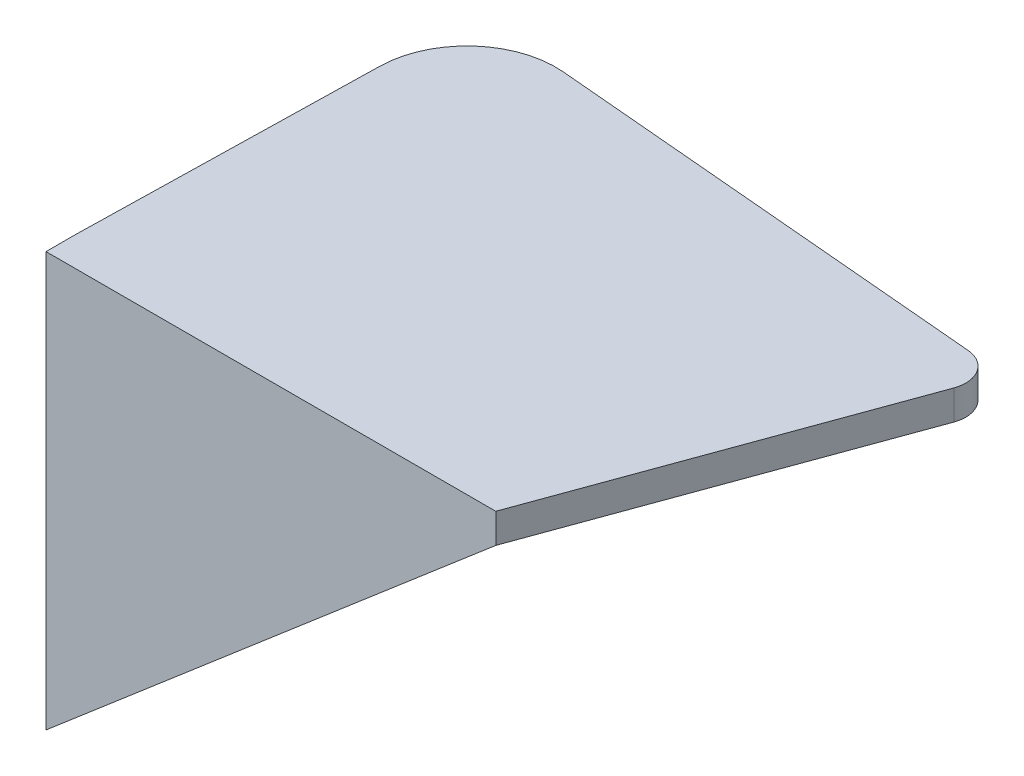
ISO-10303-21;
HEADER;
FILE_DESCRIPTION(('STEP AP214'),'2;1');
FILE_NAME('part.step','',(''),(''),'','','');
FILE_SCHEMA(('AUTOMOTIVE_DESIGN { 1 0 10303 214 1 1 1 1 }'));
ENDSEC;
DATA;
#1=APPLICATION_CONTEXT('core data for automotive mechanical design processes');
#2=APPLICATION_PROTOCOL_DEFINITION('international standard','automotive_design',2000,#1);
#3=PRODUCT_CONTEXT('',#1,'mechanical');
#4=PRODUCT('Part','Part','',(#3));
#5=PRODUCT_RELATED_PRODUCT_CATEGORY('part','',(#4));
#6=PRODUCT_DEFINITION_FORMATION('','',#4);
#7=PRODUCT_DEFINITION_CONTEXT('part definition',#1,'design');
#8=PRODUCT_DEFINITION('design','',#6,#7);
#9=PRODUCT_DEFINITION_SHAPE('','',#8);
#10=(LENGTH_UNIT() NAMED_UNIT(*) SI_UNIT(.MILLI.,.METRE.));
#11=(NAMED_UNIT(*) PLANE_ANGLE_UNIT() SI_UNIT($,.RADIAN.));
#12=(NAMED_UNIT(*) SI_UNIT($,.STERADIAN.) SOLID_ANGLE_UNIT());
#13=UNCERTAINTY_MEASURE_WITH_UNIT(LENGTH_MEASURE(1.E-05),#10,'distance_accuracy_value','');
#14=(GEOMETRIC_REPRESENTATION_CONTEXT(3) GLOBAL_UNCERTAINTY_ASSIGNED_CONTEXT((#13)) GLOBAL_UNIT_ASSIGNED_CONTEXT((#10,
#11,#12)) REPRESENTATION_CONTEXT('',''));
#15=CARTESIAN_POINT('',(0.,0.,0.));
#16=DIRECTION('',(0.,0.,1.));
#17=DIRECTION('',(1.,0.,0.));
#18=AXIS2_PLACEMENT_3D('',#15,#16,#17);
#19=CARTESIAN_POINT('',(0.,-130.,-10.));
#20=DIRECTION('',(-1.,0.,0.));
#21=DIRECTION('',(0.,0.,1.));
#22=AXIS2_PLACEMENT_3D('',#19,#20,#21);
#23=PLANE('',#22);
#24=DIRECTION('',(0.,-1.,0.));
#25=VECTOR('',#24,1.);
#26=CARTESIAN_POINT('',(0.,-130.,0.));
#27=LINE('',#26,#25);
#28=CARTESIAN_POINT('',(0.,10.,0.));
#29=VERTEX_POINT('',#28);
#30=CARTESIAN_POINT('',(0.,-130.,0.));
#31=VERTEX_POINT('',#30);
#32=EDGE_CURVE('E154',#29,#31,#27,.T.);
#33=ORIENTED_EDGE('',*,*,#32,.F.);
#34=DIRECTION('',(0.,0.,1.));
#35=VECTOR('',#34,1.);
#36=CARTESIAN_POINT('',(0.,10.,0.));
#37=LINE('',#36,#35);
#38=CARTESIAN_POINT('',(0.,10.,-10.));
#39=VERTEX_POINT('',#38);
#40=EDGE_CURVE('E177',#39,#29,#37,.T.);
#41=ORIENTED_EDGE('',*,*,#40,.F.);
#42=DIRECTION('',(0.,-1.,0.));
#43=VECTOR('',#42,1.);
#44=CARTESIAN_POINT('',(0.,10.,-10.));
#45=LINE('',#44,#43);
#46=CARTESIAN_POINT('',(0.,0.,-10.));
#47=VERTEX_POINT('',#46);
#48=EDGE_CURVE('E149',#39,#47,#45,.T.);
#49=ORIENTED_EDGE('',*,*,#48,.T.);
#50=DIRECTION('',(0.,-1.,0.));
#51=VECTOR('',#50,1.);
#52=CARTESIAN_POINT('',(0.,-130.,-10.));
#53=LINE('',#52,#51);
#54=CARTESIAN_POINT('',(0.,-130.,-10.));
#55=VERTEX_POINT('',#54);
#56=EDGE_CURVE('E155',#47,#55,#53,.T.);
#57=ORIENTED_EDGE('',*,*,#56,.T.);
#58=DIRECTION('',(0.,0.,1.));
#59=VECTOR('',#58,1.);
#60=CARTESIAN_POINT('',(0.,-130.,-10.));
#61=LINE('',#60,#59);
#62=EDGE_CURVE('E35',#55,#31,#61,.T.);
#63=ORIENTED_EDGE('',*,*,#62,.T.);
#64=EDGE_LOOP('',(#33,#41,#49,#57,#63));
#65=FACE_BOUND('',#64,.T.);
#66=ADVANCED_FACE('F32',(#65),#23,.T.);
#67=CARTESIAN_POINT('',(151.986841535707,0.,-10.));
#68=DIRECTION('',(0.65,-0.759934207678533,0.));
#69=DIRECTION('',(0.759934207678533,0.65,0.));
#70=AXIS2_PLACEMENT_3D('',#67,#68,#69);
#71=PLANE('',#70);
#72=DIRECTION('',(0.759934207678533,0.65,0.));
#73=VECTOR('',#72,1.);
#74=CARTESIAN_POINT('',(151.986841535707,0.,0.));
#75=LINE('',#74,#73);
#76=CARTESIAN_POINT('',(151.986841535707,0.,0.));
#77=VERTEX_POINT('',#76);
#78=EDGE_CURVE('E157',#31,#77,#75,.T.);
#79=ORIENTED_EDGE('',*,*,#78,.F.);
#80=ORIENTED_EDGE('',*,*,#62,.F.);
#81=DIRECTION('',(0.759934207678533,0.65,0.));
#82=VECTOR('',#81,1.);
#83=CARTESIAN_POINT('',(151.986841535707,0.,-10.));
#84=LINE('',#83,#82);
#85=CARTESIAN_POINT('',(151.986841535707,0.,-10.));
#86=VERTEX_POINT('',#85);
#87=EDGE_CURVE('E47',#55,#86,#84,.T.);
#88=ORIENTED_EDGE('',*,*,#87,.T.);
#89=DIRECTION('',(0.,0.,1.));
#90=VECTOR('',#89,1.);
#91=CARTESIAN_POINT('',(151.986841535707,0.,-10.));
#92=LINE('',#91,#90);
#93=EDGE_CURVE('E11',#86,#77,#92,.T.);
#94=ORIENTED_EDGE('',*,*,#93,.T.);
#95=EDGE_LOOP('',(#79,#80,#88,#94));
#96=FACE_BOUND('',#95,.T.);
#97=ADVANCED_FACE('F185',(#96),#71,.T.);
#98=CARTESIAN_POINT('',(0.,0.,-10.));
#99=DIRECTION('',(0.,0.,-1.));
#100=DIRECTION('',(-1.,0.,0.));
#101=AXIS2_PLACEMENT_3D('',#98,#99,#100);
#102=PLANE('',#101);
#103=ORIENTED_EDGE('',*,*,#56,.F.);
#104=DIRECTION('',(-1.,0.,0.));
#105=VECTOR('',#104,1.);
#106=CARTESIAN_POINT('',(0.,0.,-10.));
#107=LINE('',#106,#105);
#108=EDGE_CURVE('E159',#86,#47,#107,.T.);
#109=ORIENTED_EDGE('',*,*,#108,.F.);
#110=ORIENTED_EDGE('',*,*,#87,.F.);
#111=EDGE_LOOP('',(#103,#109,#110));
#112=FACE_BOUND('',#111,.T.);
#113=ADVANCED_FACE('F183',(#112),#102,.T.);
#114=CARTESIAN_POINT('',(0.,0.,0.));
#115=DIRECTION('',(0.,0.,-1.));
#116=DIRECTION('',(-1.,0.,0.));
#117=AXIS2_PLACEMENT_3D('',#114,#115,#116);
#118=PLANE('',#117);
#119=ORIENTED_EDGE('',*,*,#32,.T.);
#120=ORIENTED_EDGE('',*,*,#78,.T.);
#121=DIRECTION('',(0.,-1.,0.));
#122=VECTOR('',#121,1.);
#123=CARTESIAN_POINT('',(151.986841535707,10.,0.));
#124=LINE('',#123,#122);
#125=CARTESIAN_POINT('',(151.986841535707,10.,0.));
#126=VERTEX_POINT('',#125);
#127=EDGE_CURVE('E126',#126,#77,#124,.T.);
#128=ORIENTED_EDGE('',*,*,#127,.F.);
#129=DIRECTION('',(1.,0.,0.));
#130=VECTOR('',#129,1.);
#131=CARTESIAN_POINT('',(0.,10.,0.));
#132=LINE('',#131,#130);
#133=EDGE_CURVE('E114',#29,#126,#132,.T.);
#134=ORIENTED_EDGE('',*,*,#133,.F.);
#135=EDGE_LOOP('',(#119,#120,#128,#134));
#136=FACE_BOUND('',#135,.T.);
#137=ADVANCED_FACE('F166',(#136),#118,.F.);
#138=CARTESIAN_POINT('',(32.1554391729952,10.,-110.114159057248));
#139=DIRECTION('',(0.,-1.,0.));
#140=DIRECTION('',(0.,0.,-1.));
#141=AXIS2_PLACEMENT_3D('',#138,#139,#140);
#142=CYLINDRICAL_SURFACE('',#141,30.);
#143=CARTESIAN_POINT('',(32.1554391729952,0.,-110.114159057248));
#144=DIRECTION('',(0.,1.,0.));
#145=DIRECTION('',(0.,0.,1.));
#146=AXIS2_PLACEMENT_3D('',#143,#144,#145);
#147=CIRCLE('',#146,30.);
#148=CARTESIAN_POINT('',(34.7701114554249,0.,-140.));
#149=VERTEX_POINT('',#148);
#150=CARTESIAN_POINT('',(2.16234528639779,0.,-110.757835303318));
#151=VERTEX_POINT('',#150);
#152=EDGE_CURVE('E135',#149,#151,#147,.T.);
#153=ORIENTED_EDGE('',*,*,#152,.T.);
#154=DIRECTION('',(0.,-1.,0.));
#155=VECTOR('',#154,1.);
#156=CARTESIAN_POINT('',(2.16234528639779,10.,-110.757835303318));
#157=LINE('',#156,#155);
#158=CARTESIAN_POINT('',(2.16234528639779,10.,-110.757835303318));
#159=VERTEX_POINT('',#158);
#160=EDGE_CURVE('E152',#159,#151,#157,.T.);
#161=ORIENTED_EDGE('',*,*,#160,.F.);
#162=CARTESIAN_POINT('',(32.1554391729952,10.,-110.114159057248));
#163=DIRECTION('',(0.,1.,0.));
#164=DIRECTION('',(0.,0.,1.));
#165=AXIS2_PLACEMENT_3D('',#162,#163,#164);
#166=CIRCLE('',#165,30.);
#167=CARTESIAN_POINT('',(34.7701114554249,10.,-140.));
#168=VERTEX_POINT('',#167);
#169=EDGE_CURVE('E145',#168,#159,#166,.T.);
#170=ORIENTED_EDGE('',*,*,#169,.F.);
#171=DIRECTION('',(0.,-1.,0.));
#172=VECTOR('',#171,1.);
#173=CARTESIAN_POINT('',(34.7701114554249,10.,-140.));
#174=LINE('',#173,#172);
#175=EDGE_CURVE('E131',#168,#149,#174,.T.);
#176=ORIENTED_EDGE('',*,*,#175,.T.);
#177=EDGE_LOOP('',(#153,#161,#170,#176));
#178=FACE_BOUND('',#177,.T.);
#179=ADVANCED_FACE('F175',(#178),#142,.T.);
#180=CARTESIAN_POINT('',(0.,10.,-10.));
#181=DIRECTION('',(0.999769796219913,0.,0.0214558748689972));
#182=DIRECTION('',(0.0214558748689972,0.,-0.999769796219913));
#183=AXIS2_PLACEMENT_3D('',#180,#181,#182);
#184=PLANE('',#183);
#185=DIRECTION('',(-0.0214558748689972,0.,0.999769796219913));
#186=VECTOR('',#185,1.);
#187=CARTESIAN_POINT('',(0.,0.,-10.));
#188=LINE('',#187,#186);
#189=EDGE_CURVE('E138',#151,#47,#188,.T.);
#190=ORIENTED_EDGE('',*,*,#189,.T.);
#191=ORIENTED_EDGE('',*,*,#48,.F.);
#192=DIRECTION('',(-0.0214558748689972,0.,0.999769796219913));
#193=VECTOR('',#192,1.);
#194=CARTESIAN_POINT('',(0.,10.,-10.));
#195=LINE('',#194,#193);
#196=EDGE_CURVE('E97',#159,#39,#195,.T.);
#197=ORIENTED_EDGE('',*,*,#196,.F.);
#198=ORIENTED_EDGE('',*,*,#160,.T.);
#199=EDGE_LOOP('',(#190,#191,#197,#198));
#200=FACE_BOUND('',#199,.T.);
#201=ADVANCED_FACE('F181',(#200),#184,.F.);
#202=CARTESIAN_POINT('',(151.986841535707,10.,0.));
#203=DIRECTION('',(-0.93969262078591,0.,-0.342020143325665));
#204=DIRECTION('',(-0.342020143325665,0.,0.93969262078591));
#205=AXIS2_PLACEMENT_3D('',#202,#203,#204);
#206=PLANE('',#205);
#207=DIRECTION('',(0.342020143325665,0.,-0.93969262078591));
#208=VECTOR('',#207,1.);
#209=CARTESIAN_POINT('',(151.986841535707,0.,0.));
#210=LINE('',#209,#208);
#211=CARTESIAN_POINT('',(193.295480235807,0.,-113.494552056937));
#212=VERTEX_POINT('',#211);
#213=EDGE_CURVE('E123',#77,#212,#210,.T.);
#214=ORIENTED_EDGE('',*,*,#213,.T.);
#215=DIRECTION('',(0.,-1.,0.));
#216=VECTOR('',#215,1.);
#217=CARTESIAN_POINT('',(193.295480235807,10.,-113.494552056937));
#218=LINE('',#217,#216);
#219=CARTESIAN_POINT('',(193.295480235807,10.,-113.494552056937));
#220=VERTEX_POINT('',#219);
#221=EDGE_CURVE('E120',#220,#212,#218,.T.);
#222=ORIENTED_EDGE('',*,*,#221,.F.);
#223=DIRECTION('',(0.342020143325665,0.,-0.93969262078591));
#224=VECTOR('',#223,1.);
#225=CARTESIAN_POINT('',(151.986841535707,10.,0.));
#226=LINE('',#225,#224);
#227=EDGE_CURVE('E106',#126,#220,#226,.T.);
#228=ORIENTED_EDGE('',*,*,#227,.F.);
#229=ORIENTED_EDGE('',*,*,#127,.T.);
#230=EDGE_LOOP('',(#214,#222,#228,#229));
#231=FACE_BOUND('',#230,.T.);
#232=ADVANCED_FACE('F121',(#231),#206,.F.);
#233=CARTESIAN_POINT('',(183.898554027948,10.,-116.914753490194));
#234=DIRECTION('',(0.,-1.,0.));
#235=DIRECTION('',(0.,0.,-1.));
#236=AXIS2_PLACEMENT_3D('',#233,#234,#235);
#237=CYLINDRICAL_SURFACE('',#236,9.99999999999997);
#238=CARTESIAN_POINT('',(183.898554027948,0.,-116.914753490194));
#239=DIRECTION('',(0.,1.,0.));
#240=DIRECTION('',(0.,0.,1.));
#241=AXIS2_PLACEMENT_3D('',#238,#239,#240);
#242=CIRCLE('',#241,9.99999999999997);
#243=CARTESIAN_POINT('',(184.770111455425,0.,-126.876700471111));
#244=VERTEX_POINT('',#243);
#245=EDGE_CURVE('E142',#212,#244,#242,.T.);
#246=ORIENTED_EDGE('',*,*,#245,.T.);
#247=DIRECTION('',(0.,-1.,0.));
#248=VECTOR('',#247,1.);
#249=CARTESIAN_POINT('',(184.770111455425,10.,-126.876700471111));
#250=LINE('',#249,#248);
#251=CARTESIAN_POINT('',(184.770111455425,10.,-126.876700471111));
#252=VERTEX_POINT('',#251);
#253=EDGE_CURVE('E127',#252,#244,#250,.T.);
#254=ORIENTED_EDGE('',*,*,#253,.F.);
#255=CARTESIAN_POINT('',(183.898554027948,10.,-116.914753490194));
#256=DIRECTION('',(0.,1.,0.));
#257=DIRECTION('',(0.,0.,1.));
#258=AXIS2_PLACEMENT_3D('',#255,#256,#257);
#259=CIRCLE('',#258,9.99999999999997);
#260=EDGE_CURVE('E110',#220,#252,#259,.T.);
#261=ORIENTED_EDGE('',*,*,#260,.F.);
#262=ORIENTED_EDGE('',*,*,#221,.T.);
#263=EDGE_LOOP('',(#246,#254,#261,#262));
#264=FACE_BOUND('',#263,.T.);
#265=ADVANCED_FACE('F129',(#264),#237,.T.);
#266=CARTESIAN_POINT('',(34.7701114554249,10.,-140.));
#267=DIRECTION('',(-0.0871557427476578,0.,0.996194698091746));
#268=DIRECTION('',(0.996194698091746,0.,0.0871557427476578));
#269=AXIS2_PLACEMENT_3D('',#266,#267,#268);
#270=PLANE('',#269);
#271=DIRECTION('',(-0.996194698091746,0.,-0.0871557427476578));
#272=VECTOR('',#271,1.);
#273=CARTESIAN_POINT('',(34.7701114554249,0.,-140.));
#274=LINE('',#273,#272);
#275=EDGE_CURVE('E88',#244,#149,#274,.T.);
#276=ORIENTED_EDGE('',*,*,#275,.T.);
#277=ORIENTED_EDGE('',*,*,#175,.F.);
#278=DIRECTION('',(-0.996194698091746,0.,-0.0871557427476578));
#279=VECTOR('',#278,1.);
#280=CARTESIAN_POINT('',(34.7701114554249,10.,-140.));
#281=LINE('',#280,#279);
#282=EDGE_CURVE('E65',#252,#168,#281,.T.);
#283=ORIENTED_EDGE('',*,*,#282,.F.);
#284=ORIENTED_EDGE('',*,*,#253,.T.);
#285=EDGE_LOOP('',(#276,#277,#283,#284));
#286=FACE_BOUND('',#285,.T.);
#287=ADVANCED_FACE('F171',(#286),#270,.F.);
#288=CARTESIAN_POINT('',(32.1554391729952,10.,-110.114159057248));
#289=DIRECTION('',(0.,1.,0.));
#290=DIRECTION('',(0.,0.,1.));
#291=AXIS2_PLACEMENT_3D('',#288,#289,#290);
#292=PLANE('',#291);
#293=ORIENTED_EDGE('',*,*,#169,.T.);
#294=ORIENTED_EDGE('',*,*,#196,.T.);
#295=ORIENTED_EDGE('',*,*,#40,.T.);
#296=ORIENTED_EDGE('',*,*,#133,.T.);
#297=ORIENTED_EDGE('',*,*,#227,.T.);
#298=ORIENTED_EDGE('',*,*,#260,.T.);
#299=ORIENTED_EDGE('',*,*,#282,.T.);
#300=EDGE_LOOP('',(#293,#294,#295,#296,#297,#298,#299));
#301=FACE_BOUND('',#300,.T.);
#302=ADVANCED_FACE('F108',(#301),#292,.T.);
#303=CARTESIAN_POINT('',(32.1554391729952,0.,-110.114159057248));
#304=DIRECTION('',(0.,1.,0.));
#305=DIRECTION('',(0.,0.,1.));
#306=AXIS2_PLACEMENT_3D('',#303,#304,#305);
#307=PLANE('',#306);
#308=ORIENTED_EDGE('',*,*,#93,.F.);
#309=ORIENTED_EDGE('',*,*,#108,.T.);
#310=ORIENTED_EDGE('',*,*,#189,.F.);
#311=ORIENTED_EDGE('',*,*,#152,.F.);
#312=ORIENTED_EDGE('',*,*,#275,.F.);
#313=ORIENTED_EDGE('',*,*,#245,.F.);
#314=ORIENTED_EDGE('',*,*,#213,.F.);
#315=EDGE_LOOP('',(#308,#309,#310,#311,#312,#313,#314));
#316=FACE_BOUND('',#315,.T.);
#317=ADVANCED_FACE('F169',(#316),#307,.F.);
#318=CLOSED_SHELL('',(#66,#97,#113,#137,#179,#201,#232,#265,#287,#302,#317));
#319=MANIFOLD_SOLID_BREP('B2',#318);
#320=ADVANCED_BREP_SHAPE_REPRESENTATION('',(#18,#319),#14);
#321=SHAPE_DEFINITION_REPRESENTATION(#9,#320);
ENDSEC;
END-ISO-10303-21;
